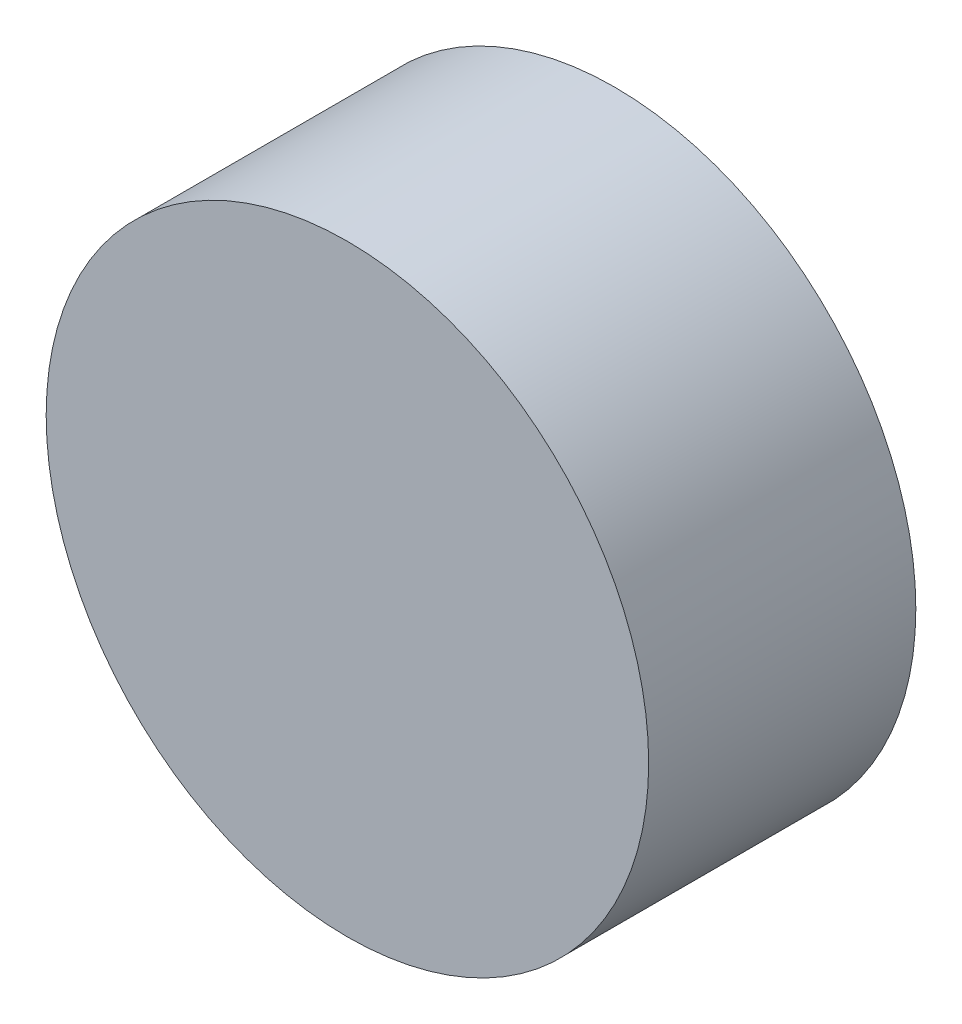
ISO-10303-21;
HEADER;
FILE_DESCRIPTION(('STEP AP214'),'2;1');
FILE_NAME('part.step','',(''),(''),'','','');
FILE_SCHEMA(('AUTOMOTIVE_DESIGN { 1 0 10303 214 1 1 1 1 }'));
ENDSEC;
DATA;
#1=APPLICATION_CONTEXT('core data for automotive mechanical design processes');
#2=APPLICATION_PROTOCOL_DEFINITION('international standard','automotive_design',2000,#1);
#3=PRODUCT_CONTEXT('',#1,'mechanical');
#4=PRODUCT('Part','Part','',(#3));
#5=PRODUCT_RELATED_PRODUCT_CATEGORY('part','',(#4));
#6=PRODUCT_DEFINITION_FORMATION('','',#4);
#7=PRODUCT_DEFINITION_CONTEXT('part definition',#1,'design');
#8=PRODUCT_DEFINITION('design','',#6,#7);
#9=PRODUCT_DEFINITION_SHAPE('','',#8);
#10=(LENGTH_UNIT() NAMED_UNIT(*) SI_UNIT(.MILLI.,.METRE.));
#11=(NAMED_UNIT(*) PLANE_ANGLE_UNIT() SI_UNIT($,.RADIAN.));
#12=(NAMED_UNIT(*) SI_UNIT($,.STERADIAN.) SOLID_ANGLE_UNIT());
#13=UNCERTAINTY_MEASURE_WITH_UNIT(LENGTH_MEASURE(1.E-05),#10,'distance_accuracy_value','');
#14=(GEOMETRIC_REPRESENTATION_CONTEXT(3) GLOBAL_UNCERTAINTY_ASSIGNED_CONTEXT((#13)) GLOBAL_UNIT_ASSIGNED_CONTEXT((#10,
#11,#12)) REPRESENTATION_CONTEXT('',''));
#15=CARTESIAN_POINT('',(0.,0.,0.));
#16=DIRECTION('',(0.,0.,1.));
#17=DIRECTION('',(1.,0.,0.));
#18=AXIS2_PLACEMENT_3D('',#15,#16,#17);
#19=CARTESIAN_POINT('',(0.,0.,19.));
#20=DIRECTION('',(0.,0.,-1.));
#21=DIRECTION('',(-1.,0.,0.));
#22=AXIS2_PLACEMENT_3D('',#19,#20,#21);
#23=CYLINDRICAL_SURFACE('',#22,21.4251296573026);
#24=CARTESIAN_POINT('',(0.,0.,19.));
#25=DIRECTION('',(0.,0.,1.));
#26=DIRECTION('',(1.,0.,0.));
#27=AXIS2_PLACEMENT_3D('',#24,#25,#26);
#28=CIRCLE('',#27,21.4251296573026);
#29=CARTESIAN_POINT('',(21.4251296573026,0.,19.));
#30=VERTEX_POINT('',#29);
#31=EDGE_CURVE('E10',#30,#30,#28,.T.);
#32=ORIENTED_EDGE('',*,*,#31,.F.);
#33=EDGE_LOOP('',(#32));
#34=FACE_BOUND('',#33,.T.);
#35=CARTESIAN_POINT('',(0.,0.,0.));
#36=DIRECTION('',(0.,0.,1.));
#37=DIRECTION('',(1.,0.,0.));
#38=AXIS2_PLACEMENT_3D('',#35,#36,#37);
#39=CIRCLE('',#38,21.4251296573026);
#40=CARTESIAN_POINT('',(21.4251296573026,0.,0.));
#41=VERTEX_POINT('',#40);
#42=EDGE_CURVE('E41',#41,#41,#39,.T.);
#43=ORIENTED_EDGE('',*,*,#42,.T.);
#44=EDGE_LOOP('',(#43));
#45=FACE_BOUND('',#44,.T.);
#46=ADVANCED_FACE('F38',(#34,#45),#23,.T.);
#47=CARTESIAN_POINT('',(0.,0.,19.));
#48=DIRECTION('',(0.,0.,1.));
#49=DIRECTION('',(1.,0.,0.));
#50=AXIS2_PLACEMENT_3D('',#47,#48,#49);
#51=PLANE('',#50);
#52=ORIENTED_EDGE('',*,*,#31,.T.);
#53=EDGE_LOOP('',(#52));
#54=FACE_BOUND('',#53,.T.);
#55=ADVANCED_FACE('F53',(#54),#51,.T.);
#56=CARTESIAN_POINT('',(0.,0.,0.));
#57=DIRECTION('',(0.,0.,1.));
#58=DIRECTION('',(1.,0.,0.));
#59=AXIS2_PLACEMENT_3D('',#56,#57,#58);
#60=PLANE('',#59);
#61=ORIENTED_EDGE('',*,*,#42,.F.);
#62=EDGE_LOOP('',(#61));
#63=FACE_BOUND('',#62,.T.);
#64=ADVANCED_FACE('F51',(#63),#60,.F.);
#65=CLOSED_SHELL('',(#46,#55,#64));
#66=MANIFOLD_SOLID_BREP('B2',#65);
#67=ADVANCED_BREP_SHAPE_REPRESENTATION('',(#18,#66),#14);
#68=SHAPE_DEFINITION_REPRESENTATION(#9,#67);
ENDSEC;
END-ISO-10303-21;
